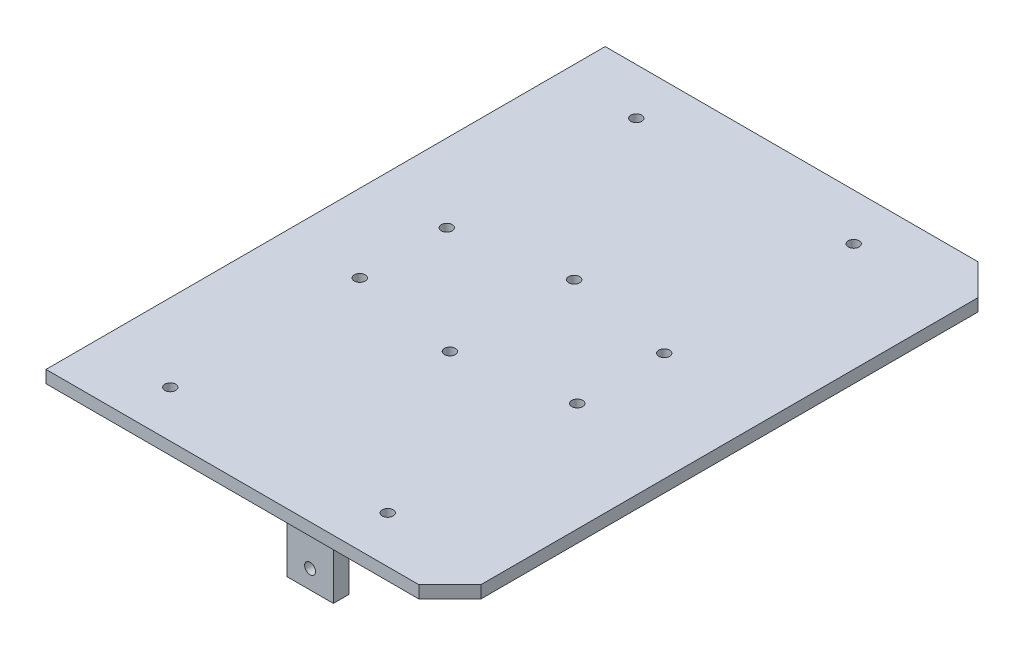
ISO-10303-21;
HEADER;
FILE_DESCRIPTION(('STEP AP214'),'2;1');
FILE_NAME('part.step','',(''),(''),'','','');
FILE_SCHEMA(('AUTOMOTIVE_DESIGN { 1 0 10303 214 1 1 1 1 }'));
ENDSEC;
DATA;
#1=APPLICATION_CONTEXT('core data for automotive mechanical design processes');
#2=APPLICATION_PROTOCOL_DEFINITION('international standard','automotive_design',2000,#1);
#3=PRODUCT_CONTEXT('',#1,'mechanical');
#4=PRODUCT('Part','Part','',(#3));
#5=PRODUCT_RELATED_PRODUCT_CATEGORY('part','',(#4));
#6=PRODUCT_DEFINITION_FORMATION('','',#4);
#7=PRODUCT_DEFINITION_CONTEXT('part definition',#1,'design');
#8=PRODUCT_DEFINITION('design','',#6,#7);
#9=PRODUCT_DEFINITION_SHAPE('','',#8);
#10=(LENGTH_UNIT() NAMED_UNIT(*) SI_UNIT(.MILLI.,.METRE.));
#11=(NAMED_UNIT(*) PLANE_ANGLE_UNIT() SI_UNIT($,.RADIAN.));
#12=(NAMED_UNIT(*) SI_UNIT($,.STERADIAN.) SOLID_ANGLE_UNIT());
#13=UNCERTAINTY_MEASURE_WITH_UNIT(LENGTH_MEASURE(1.E-05),#10,'distance_accuracy_value','');
#14=(GEOMETRIC_REPRESENTATION_CONTEXT(3) GLOBAL_UNCERTAINTY_ASSIGNED_CONTEXT((#13)) GLOBAL_UNIT_ASSIGNED_CONTEXT((#10,
#11,#12)) REPRESENTATION_CONTEXT('',''));
#15=CARTESIAN_POINT('',(0.,0.,0.));
#16=DIRECTION('',(0.,0.,1.));
#17=DIRECTION('',(1.,0.,0.));
#18=AXIS2_PLACEMENT_3D('',#15,#16,#17);
#19=CARTESIAN_POINT('',(0.,0.,0.));
#20=DIRECTION('',(0.,-1.,0.));
#21=DIRECTION('',(0.,0.,-1.));
#22=AXIS2_PLACEMENT_3D('',#19,#20,#21);
#23=PLANE('',#22);
#24=DIRECTION('',(-1.,0.,0.));
#25=VECTOR('',#24,1.);
#26=CARTESIAN_POINT('',(97.5,0.,-70.));
#27=LINE('',#26,#25);
#28=CARTESIAN_POINT('',(97.5,0.,-70.));
#29=VERTEX_POINT('',#28);
#30=CARTESIAN_POINT('',(82.5,0.,-70.));
#31=VERTEX_POINT('',#30);
#32=EDGE_CURVE('E296',#29,#31,#27,.T.);
#33=ORIENTED_EDGE('',*,*,#32,.F.);
#34=DIRECTION('',(0.,0.,1.));
#35=VECTOR('',#34,1.);
#36=CARTESIAN_POINT('',(97.5,0.,-75.));
#37=LINE('',#36,#35);
#38=CARTESIAN_POINT('',(97.5,0.,-75.));
#39=VERTEX_POINT('',#38);
#40=EDGE_CURVE('E299',#39,#29,#37,.T.);
#41=ORIENTED_EDGE('',*,*,#40,.F.);
#42=DIRECTION('',(1.,0.,0.));
#43=VECTOR('',#42,1.);
#44=CARTESIAN_POINT('',(97.5,0.,-75.));
#45=LINE('',#44,#43);
#46=CARTESIAN_POINT('',(82.5,0.,-75.));
#47=VERTEX_POINT('',#46);
#48=EDGE_CURVE('E289',#47,#39,#45,.T.);
#49=ORIENTED_EDGE('',*,*,#48,.F.);
#50=DIRECTION('',(0.,0.,-1.));
#51=VECTOR('',#50,1.);
#52=CARTESIAN_POINT('',(82.5,0.,-75.));
#53=LINE('',#52,#51);
#54=EDGE_CURVE('E292',#31,#47,#53,.T.);
#55=ORIENTED_EDGE('',*,*,#54,.F.);
#56=EDGE_LOOP('',(#33,#41,#49,#55));
#57=FACE_BOUND('',#56,.T.);
#58=DIRECTION('',(0.,0.,-1.));
#59=VECTOR('',#58,1.);
#60=CARTESIAN_POINT('',(82.5,0.,75.));
#61=LINE('',#60,#59);
#62=CARTESIAN_POINT('',(82.5,0.,75.));
#63=VERTEX_POINT('',#62);
#64=CARTESIAN_POINT('',(82.5,0.,70.));
#65=VERTEX_POINT('',#64);
#66=EDGE_CURVE('E337',#63,#65,#61,.T.);
#67=ORIENTED_EDGE('',*,*,#66,.F.);
#68=DIRECTION('',(-1.,0.,0.));
#69=VECTOR('',#68,1.);
#70=CARTESIAN_POINT('',(97.5,0.,75.));
#71=LINE('',#70,#69);
#72=CARTESIAN_POINT('',(97.5,0.,75.));
#73=VERTEX_POINT('',#72);
#74=EDGE_CURVE('E340',#73,#63,#71,.T.);
#75=ORIENTED_EDGE('',*,*,#74,.F.);
#76=DIRECTION('',(0.,0.,1.));
#77=VECTOR('',#76,1.);
#78=CARTESIAN_POINT('',(97.5,0.,75.));
#79=LINE('',#78,#77);
#80=CARTESIAN_POINT('',(97.5,0.,70.));
#81=VERTEX_POINT('',#80);
#82=EDGE_CURVE('E329',#81,#73,#79,.T.);
#83=ORIENTED_EDGE('',*,*,#82,.F.);
#84=DIRECTION('',(1.,0.,0.));
#85=VECTOR('',#84,1.);
#86=CARTESIAN_POINT('',(97.5,0.,70.));
#87=LINE('',#86,#85);
#88=EDGE_CURVE('E332',#65,#81,#87,.T.);
#89=ORIENTED_EDGE('',*,*,#88,.F.);
#90=EDGE_LOOP('',(#67,#75,#83,#89));
#91=FACE_BOUND('',#90,.T.);
#92=CARTESIAN_POINT('',(115.,0.,-75.));
#93=DIRECTION('',(0.,-1.,0.));
#94=DIRECTION('',(0.,0.,-1.));
#95=AXIS2_PLACEMENT_3D('',#92,#93,#94);
#96=CIRCLE('',#95,1.75);
#97=CARTESIAN_POINT('',(115.,0.,-76.75));
#98=VERTEX_POINT('',#97);
#99=EDGE_CURVE('E214',#98,#98,#96,.T.);
#100=ORIENTED_EDGE('',*,*,#99,.F.);
#101=EDGE_LOOP('',(#100));
#102=FACE_BOUND('',#101,.T.);
#103=CARTESIAN_POINT('',(44.9999999999999,0.,-75.));
#104=DIRECTION('',(0.,-1.,0.));
#105=DIRECTION('',(0.,0.,-1.));
#106=AXIS2_PLACEMENT_3D('',#103,#104,#105);
#107=CIRCLE('',#106,1.75);
#108=CARTESIAN_POINT('',(44.9999999999999,0.,-76.75));
#109=VERTEX_POINT('',#108);
#110=EDGE_CURVE('E218',#109,#109,#107,.T.);
#111=ORIENTED_EDGE('',*,*,#110,.F.);
#112=EDGE_LOOP('',(#111));
#113=FACE_BOUND('',#112,.T.);
#114=CARTESIAN_POINT('',(44.9999999999999,0.,-14.));
#115=DIRECTION('',(0.,-1.,0.));
#116=DIRECTION('',(0.,0.,-1.));
#117=AXIS2_PLACEMENT_3D('',#114,#115,#116);
#118=CIRCLE('',#117,1.75);
#119=CARTESIAN_POINT('',(44.9999999999999,0.,-15.75));
#120=VERTEX_POINT('',#119);
#121=EDGE_CURVE('E223',#120,#120,#118,.T.);
#122=ORIENTED_EDGE('',*,*,#121,.F.);
#123=EDGE_LOOP('',(#122));
#124=FACE_BOUND('',#123,.T.);
#125=CARTESIAN_POINT('',(44.9999999999999,0.,14.));
#126=DIRECTION('',(0.,-1.,0.));
#127=DIRECTION('',(0.,0.,-1.));
#128=AXIS2_PLACEMENT_3D('',#125,#126,#127);
#129=CIRCLE('',#128,1.75);
#130=CARTESIAN_POINT('',(44.9999999999999,0.,12.25));
#131=VERTEX_POINT('',#130);
#132=EDGE_CURVE('E227',#131,#131,#129,.T.);
#133=ORIENTED_EDGE('',*,*,#132,.F.);
#134=EDGE_LOOP('',(#133));
#135=FACE_BOUND('',#134,.T.);
#136=CARTESIAN_POINT('',(45.,0.,75.));
#137=DIRECTION('',(0.,-1.,0.));
#138=DIRECTION('',(0.,0.,-1.));
#139=AXIS2_PLACEMENT_3D('',#136,#137,#138);
#140=CIRCLE('',#139,1.75);
#141=CARTESIAN_POINT('',(45.,0.,73.25));
#142=VERTEX_POINT('',#141);
#143=EDGE_CURVE('E231',#142,#142,#140,.T.);
#144=ORIENTED_EDGE('',*,*,#143,.F.);
#145=EDGE_LOOP('',(#144));
#146=FACE_BOUND('',#145,.T.);
#147=CARTESIAN_POINT('',(115.,0.,75.));
#148=DIRECTION('',(0.,-1.,0.));
#149=DIRECTION('',(0.,0.,-1.));
#150=AXIS2_PLACEMENT_3D('',#147,#148,#149);
#151=CIRCLE('',#150,1.75);
#152=CARTESIAN_POINT('',(115.,0.,73.25));
#153=VERTEX_POINT('',#152);
#154=EDGE_CURVE('E235',#153,#153,#151,.T.);
#155=ORIENTED_EDGE('',*,*,#154,.F.);
#156=EDGE_LOOP('',(#155));
#157=FACE_BOUND('',#156,.T.);
#158=CARTESIAN_POINT('',(115.,0.,14.));
#159=DIRECTION('',(0.,-1.,0.));
#160=DIRECTION('',(0.,0.,-1.));
#161=AXIS2_PLACEMENT_3D('',#158,#159,#160);
#162=CIRCLE('',#161,1.75);
#163=CARTESIAN_POINT('',(115.,0.,12.25));
#164=VERTEX_POINT('',#163);
#165=EDGE_CURVE('E239',#164,#164,#162,.T.);
#166=ORIENTED_EDGE('',*,*,#165,.F.);
#167=EDGE_LOOP('',(#166));
#168=FACE_BOUND('',#167,.T.);
#169=CARTESIAN_POINT('',(115.,0.,-14.));
#170=DIRECTION('',(0.,-1.,0.));
#171=DIRECTION('',(0.,0.,-1.));
#172=AXIS2_PLACEMENT_3D('',#169,#170,#171);
#173=CIRCLE('',#172,1.75);
#174=CARTESIAN_POINT('',(115.,0.,-15.75));
#175=VERTEX_POINT('',#174);
#176=EDGE_CURVE('E185',#175,#175,#173,.T.);
#177=ORIENTED_EDGE('',*,*,#176,.F.);
#178=EDGE_LOOP('',(#177));
#179=FACE_BOUND('',#178,.T.);
#180=CARTESIAN_POINT('',(80.,0.,-20.));
#181=DIRECTION('',(0.,-1.,0.));
#182=DIRECTION('',(0.,0.,-1.));
#183=AXIS2_PLACEMENT_3D('',#180,#181,#182);
#184=CIRCLE('',#183,1.75);
#185=CARTESIAN_POINT('',(80.,0.,-21.75));
#186=VERTEX_POINT('',#185);
#187=EDGE_CURVE('E419',#186,#186,#184,.T.);
#188=ORIENTED_EDGE('',*,*,#187,.F.);
#189=EDGE_LOOP('',(#188));
#190=FACE_BOUND('',#189,.T.);
#191=CARTESIAN_POINT('',(80.,0.,20.));
#192=DIRECTION('',(0.,-1.,0.));
#193=DIRECTION('',(0.,0.,-1.));
#194=AXIS2_PLACEMENT_3D('',#191,#192,#193);
#195=CIRCLE('',#194,1.75);
#196=CARTESIAN_POINT('',(80.,0.,18.25));
#197=VERTEX_POINT('',#196);
#198=EDGE_CURVE('E426',#197,#197,#195,.T.);
#199=ORIENTED_EDGE('',*,*,#198,.F.);
#200=EDGE_LOOP('',(#199));
#201=FACE_BOUND('',#200,.T.);
#202=DIRECTION('',(1.,0.,0.));
#203=VECTOR('',#202,1.);
#204=CARTESIAN_POINT('',(-150.,0.,90.));
#205=LINE('',#204,#203);
#206=CARTESIAN_POINT('',(20.,0.,90.));
#207=VERTEX_POINT('',#206);
#208=CARTESIAN_POINT('',(140.,0.,90.));
#209=VERTEX_POINT('',#208);
#210=EDGE_CURVE('E177',#207,#209,#205,.T.);
#211=ORIENTED_EDGE('',*,*,#210,.F.);
#212=DIRECTION('',(0.,0.,-1.));
#213=VECTOR('',#212,1.);
#214=CARTESIAN_POINT('',(20.,0.,0.));
#215=LINE('',#214,#213);
#216=CARTESIAN_POINT('',(20.,0.,-90.));
#217=VERTEX_POINT('',#216);
#218=EDGE_CURVE('E163',#207,#217,#215,.T.);
#219=ORIENTED_EDGE('',*,*,#218,.T.);
#220=DIRECTION('',(-1.,0.,0.));
#221=VECTOR('',#220,1.);
#222=CARTESIAN_POINT('',(-150.,0.,-90.));
#223=LINE('',#222,#221);
#224=CARTESIAN_POINT('',(140.,0.,-90.));
#225=VERTEX_POINT('',#224);
#226=EDGE_CURVE('E161',#225,#217,#223,.T.);
#227=ORIENTED_EDGE('',*,*,#226,.F.);
#228=DIRECTION('',(-0.707106781186546,0.,-0.707106781186549));
#229=VECTOR('',#228,1.);
#230=CARTESIAN_POINT('',(115.,0.,-115.));
#231=LINE('',#230,#229);
#232=CARTESIAN_POINT('',(150.,0.,-80.));
#233=VERTEX_POINT('',#232);
#234=EDGE_CURVE('E196',#225,#233,#231,.F.);
#235=ORIENTED_EDGE('',*,*,#234,.T.);
#236=DIRECTION('',(0.,0.,-1.));
#237=VECTOR('',#236,1.);
#238=CARTESIAN_POINT('',(150.,0.,90.));
#239=LINE('',#238,#237);
#240=CARTESIAN_POINT('',(150.,0.,80.));
#241=VERTEX_POINT('',#240);
#242=EDGE_CURVE('E181',#241,#233,#239,.T.);
#243=ORIENTED_EDGE('',*,*,#242,.F.);
#244=DIRECTION('',(0.70710678118655,0.,-0.707106781186545));
#245=VECTOR('',#244,1.);
#246=CARTESIAN_POINT('',(114.999999999999,0.,115.));
#247=LINE('',#246,#245);
#248=EDGE_CURVE('E199',#241,#209,#247,.F.);
#249=ORIENTED_EDGE('',*,*,#248,.T.);
#250=EDGE_LOOP('',(#211,#219,#227,#235,#243,#249));
#251=FACE_BOUND('',#250,.T.);
#252=ADVANCED_FACE('F46',(#57,#91,#102,#113,#124,#135,#146,#157,#168,#179,#190,#201,#251),#23,.T.);
#253=CARTESIAN_POINT('',(-150.,4.,-90.));
#254=DIRECTION('',(0.,0.,1.));
#255=DIRECTION('',(1.,0.,0.));
#256=AXIS2_PLACEMENT_3D('',#253,#254,#255);
#257=PLANE('',#256);
#258=DIRECTION('',(0.,-1.,0.));
#259=VECTOR('',#258,1.);
#260=CARTESIAN_POINT('',(20.,4.,-90.));
#261=LINE('',#260,#259);
#262=CARTESIAN_POINT('',(20.,4.,-90.));
#263=VERTEX_POINT('',#262);
#264=EDGE_CURVE('E148',#263,#217,#261,.T.);
#265=ORIENTED_EDGE('',*,*,#264,.F.);
#266=DIRECTION('',(-1.,0.,0.));
#267=VECTOR('',#266,1.);
#268=CARTESIAN_POINT('',(-150.,4.,-90.));
#269=LINE('',#268,#267);
#270=CARTESIAN_POINT('',(140.,4.,-90.));
#271=VERTEX_POINT('',#270);
#272=EDGE_CURVE('E158',#271,#263,#269,.T.);
#273=ORIENTED_EDGE('',*,*,#272,.F.);
#274=DIRECTION('',(0.,-1.,0.));
#275=VECTOR('',#274,1.);
#276=CARTESIAN_POINT('',(140.,4.,-90.));
#277=LINE('',#276,#275);
#278=EDGE_CURVE('E56',#271,#225,#277,.T.);
#279=ORIENTED_EDGE('',*,*,#278,.T.);
#280=ORIENTED_EDGE('',*,*,#226,.T.);
#281=EDGE_LOOP('',(#265,#273,#279,#280));
#282=FACE_BOUND('',#281,.T.);
#283=ADVANCED_FACE('F156',(#282),#257,.F.);
#284=CARTESIAN_POINT('',(-150.,4.,90.));
#285=DIRECTION('',(0.,0.,-1.));
#286=DIRECTION('',(-1.,0.,0.));
#287=AXIS2_PLACEMENT_3D('',#284,#285,#286);
#288=PLANE('',#287);
#289=DIRECTION('',(0.,1.,0.));
#290=VECTOR('',#289,1.);
#291=CARTESIAN_POINT('',(20.,4.,90.));
#292=LINE('',#291,#290);
#293=CARTESIAN_POINT('',(20.,4.,90.));
#294=VERTEX_POINT('',#293);
#295=EDGE_CURVE('E62',#207,#294,#292,.T.);
#296=ORIENTED_EDGE('',*,*,#295,.F.);
#297=ORIENTED_EDGE('',*,*,#210,.T.);
#298=DIRECTION('',(0.,1.,0.));
#299=VECTOR('',#298,1.);
#300=CARTESIAN_POINT('',(140.,4.,90.));
#301=LINE('',#300,#299);
#302=CARTESIAN_POINT('',(140.,4.,90.));
#303=VERTEX_POINT('',#302);
#304=EDGE_CURVE('E203',#209,#303,#301,.T.);
#305=ORIENTED_EDGE('',*,*,#304,.T.);
#306=DIRECTION('',(1.,0.,0.));
#307=VECTOR('',#306,1.);
#308=CARTESIAN_POINT('',(-150.,4.,90.));
#309=LINE('',#308,#307);
#310=EDGE_CURVE('E170',#294,#303,#309,.T.);
#311=ORIENTED_EDGE('',*,*,#310,.F.);
#312=EDGE_LOOP('',(#296,#297,#305,#311));
#313=FACE_BOUND('',#312,.T.);
#314=ADVANCED_FACE('F391',(#313),#288,.F.);
#315=CARTESIAN_POINT('',(0.,4.,0.));
#316=DIRECTION('',(0.,-1.,0.));
#317=DIRECTION('',(0.,0.,-1.));
#318=AXIS2_PLACEMENT_3D('',#315,#316,#317);
#319=PLANE('',#318);
#320=CARTESIAN_POINT('',(115.,4.,-75.));
#321=DIRECTION('',(0.,1.,0.));
#322=DIRECTION('',(0.,0.,1.));
#323=AXIS2_PLACEMENT_3D('',#320,#321,#322);
#324=CIRCLE('',#323,1.75);
#325=CARTESIAN_POINT('',(115.,4.,-73.25));
#326=VERTEX_POINT('',#325);
#327=EDGE_CURVE('E219',#326,#326,#324,.T.);
#328=ORIENTED_EDGE('',*,*,#327,.F.);
#329=EDGE_LOOP('',(#328));
#330=FACE_BOUND('',#329,.T.);
#331=CARTESIAN_POINT('',(44.9999999999999,4.,-75.));
#332=DIRECTION('',(0.,1.,0.));
#333=DIRECTION('',(0.,0.,-1.));
#334=AXIS2_PLACEMENT_3D('',#331,#332,#333);
#335=CIRCLE('',#334,1.75);
#336=CARTESIAN_POINT('',(44.9999999999999,4.,-76.75));
#337=VERTEX_POINT('',#336);
#338=EDGE_CURVE('E344',#337,#337,#335,.T.);
#339=ORIENTED_EDGE('',*,*,#338,.F.);
#340=EDGE_LOOP('',(#339));
#341=FACE_BOUND('',#340,.T.);
#342=CARTESIAN_POINT('',(44.9999999999999,4.,-14.));
#343=DIRECTION('',(0.,1.,0.));
#344=DIRECTION('',(0.,0.,-1.));
#345=AXIS2_PLACEMENT_3D('',#342,#343,#344);
#346=CIRCLE('',#345,1.75);
#347=CARTESIAN_POINT('',(44.9999999999999,4.,-15.75));
#348=VERTEX_POINT('',#347);
#349=EDGE_CURVE('E361',#348,#348,#346,.T.);
#350=ORIENTED_EDGE('',*,*,#349,.F.);
#351=EDGE_LOOP('',(#350));
#352=FACE_BOUND('',#351,.T.);
#353=CARTESIAN_POINT('',(44.9999999999999,4.,14.));
#354=DIRECTION('',(0.,1.,0.));
#355=DIRECTION('',(0.,0.,1.));
#356=AXIS2_PLACEMENT_3D('',#353,#354,#355);
#357=CIRCLE('',#356,1.75);
#358=CARTESIAN_POINT('',(44.9999999999999,4.,15.75));
#359=VERTEX_POINT('',#358);
#360=EDGE_CURVE('E356',#359,#359,#357,.T.);
#361=ORIENTED_EDGE('',*,*,#360,.F.);
#362=EDGE_LOOP('',(#361));
#363=FACE_BOUND('',#362,.T.);
#364=CARTESIAN_POINT('',(45.,4.,75.));
#365=DIRECTION('',(0.,1.,0.));
#366=DIRECTION('',(0.,0.,1.));
#367=AXIS2_PLACEMENT_3D('',#364,#365,#366);
#368=CIRCLE('',#367,1.75);
#369=CARTESIAN_POINT('',(45.,4.,76.75));
#370=VERTEX_POINT('',#369);
#371=EDGE_CURVE('E360',#370,#370,#368,.T.);
#372=ORIENTED_EDGE('',*,*,#371,.F.);
#373=EDGE_LOOP('',(#372));
#374=FACE_BOUND('',#373,.T.);
#375=CARTESIAN_POINT('',(115.,4.,75.));
#376=DIRECTION('',(0.,1.,0.));
#377=DIRECTION('',(0.,0.,-1.));
#378=AXIS2_PLACEMENT_3D('',#375,#376,#377);
#379=CIRCLE('',#378,1.75);
#380=CARTESIAN_POINT('',(115.,4.,73.25));
#381=VERTEX_POINT('',#380);
#382=EDGE_CURVE('E376',#381,#381,#379,.T.);
#383=ORIENTED_EDGE('',*,*,#382,.F.);
#384=EDGE_LOOP('',(#383));
#385=FACE_BOUND('',#384,.T.);
#386=CARTESIAN_POINT('',(115.,4.,14.));
#387=DIRECTION('',(0.,1.,0.));
#388=DIRECTION('',(0.,0.,-1.));
#389=AXIS2_PLACEMENT_3D('',#386,#387,#388);
#390=CIRCLE('',#389,1.75);
#391=CARTESIAN_POINT('',(115.,4.,12.25));
#392=VERTEX_POINT('',#391);
#393=EDGE_CURVE('E372',#392,#392,#390,.T.);
#394=ORIENTED_EDGE('',*,*,#393,.F.);
#395=EDGE_LOOP('',(#394));
#396=FACE_BOUND('',#395,.T.);
#397=CARTESIAN_POINT('',(115.,4.,-14.));
#398=DIRECTION('',(0.,1.,0.));
#399=DIRECTION('',(0.,0.,1.));
#400=AXIS2_PLACEMENT_3D('',#397,#398,#399);
#401=CIRCLE('',#400,1.75);
#402=CARTESIAN_POINT('',(115.,4.,-12.25));
#403=VERTEX_POINT('',#402);
#404=EDGE_CURVE('E368',#403,#403,#401,.T.);
#405=ORIENTED_EDGE('',*,*,#404,.F.);
#406=EDGE_LOOP('',(#405));
#407=FACE_BOUND('',#406,.T.);
#408=CARTESIAN_POINT('',(80.,4.,-20.));
#409=DIRECTION('',(0.,1.,0.));
#410=DIRECTION('',(0.,0.,1.));
#411=AXIS2_PLACEMENT_3D('',#408,#409,#410);
#412=CIRCLE('',#411,1.75);
#413=CARTESIAN_POINT('',(80.,4.,-18.25));
#414=VERTEX_POINT('',#413);
#415=EDGE_CURVE('E410',#414,#414,#412,.T.);
#416=ORIENTED_EDGE('',*,*,#415,.F.);
#417=EDGE_LOOP('',(#416));
#418=FACE_BOUND('',#417,.T.);
#419=CARTESIAN_POINT('',(80.,4.,20.));
#420=DIRECTION('',(0.,1.,0.));
#421=DIRECTION('',(0.,0.,-1.));
#422=AXIS2_PLACEMENT_3D('',#419,#420,#421);
#423=CIRCLE('',#422,1.75);
#424=CARTESIAN_POINT('',(80.,4.,18.25));
#425=VERTEX_POINT('',#424);
#426=EDGE_CURVE('E413',#425,#425,#423,.T.);
#427=ORIENTED_EDGE('',*,*,#426,.F.);
#428=EDGE_LOOP('',(#427));
#429=FACE_BOUND('',#428,.T.);
#430=DIRECTION('',(0.,0.,-1.));
#431=VECTOR('',#430,1.);
#432=CARTESIAN_POINT('',(20.,4.,0.));
#433=LINE('',#432,#431);
#434=EDGE_CURVE('E11',#294,#263,#433,.T.);
#435=ORIENTED_EDGE('',*,*,#434,.F.);
#436=ORIENTED_EDGE('',*,*,#310,.T.);
#437=DIRECTION('',(-0.70710678118655,0.,0.707106781186545));
#438=VECTOR('',#437,1.);
#439=CARTESIAN_POINT('',(150.,4.,80.));
#440=LINE('',#439,#438);
#441=CARTESIAN_POINT('',(150.,4.,80.));
#442=VERTEX_POINT('',#441);
#443=EDGE_CURVE('E209',#303,#442,#440,.F.);
#444=ORIENTED_EDGE('',*,*,#443,.T.);
#445=DIRECTION('',(0.,0.,-1.));
#446=VECTOR('',#445,1.);
#447=CARTESIAN_POINT('',(150.,4.,90.));
#448=LINE('',#447,#446);
#449=CARTESIAN_POINT('',(150.,4.,-80.));
#450=VERTEX_POINT('',#449);
#451=EDGE_CURVE('E171',#442,#450,#448,.T.);
#452=ORIENTED_EDGE('',*,*,#451,.T.);
#453=DIRECTION('',(0.707106781186546,0.,0.707106781186549));
#454=VECTOR('',#453,1.);
#455=CARTESIAN_POINT('',(140.,4.,-90.));
#456=LINE('',#455,#454);
#457=EDGE_CURVE('E168',#450,#271,#456,.F.);
#458=ORIENTED_EDGE('',*,*,#457,.T.);
#459=ORIENTED_EDGE('',*,*,#272,.T.);
#460=EDGE_LOOP('',(#435,#436,#444,#452,#458,#459));
#461=FACE_BOUND('',#460,.T.);
#462=ADVANCED_FACE('F165',(#330,#341,#352,#363,#374,#385,#396,#407,#418,#429,#461),#319,.F.);
#463=CARTESIAN_POINT('',(150.,4.,90.));
#464=DIRECTION('',(-1.,0.,0.));
#465=DIRECTION('',(0.,0.,1.));
#466=AXIS2_PLACEMENT_3D('',#463,#464,#465);
#467=PLANE('',#466);
#468=ORIENTED_EDGE('',*,*,#451,.F.);
#469=DIRECTION('',(0.,-1.,0.));
#470=VECTOR('',#469,1.);
#471=CARTESIAN_POINT('',(150.,4.,80.));
#472=LINE('',#471,#470);
#473=EDGE_CURVE('E192',#442,#241,#472,.T.);
#474=ORIENTED_EDGE('',*,*,#473,.T.);
#475=ORIENTED_EDGE('',*,*,#242,.T.);
#476=DIRECTION('',(0.,1.,0.));
#477=VECTOR('',#476,1.);
#478=CARTESIAN_POINT('',(150.,4.,-80.));
#479=LINE('',#478,#477);
#480=EDGE_CURVE('E175',#233,#450,#479,.T.);
#481=ORIENTED_EDGE('',*,*,#480,.T.);
#482=EDGE_LOOP('',(#468,#474,#475,#481));
#483=FACE_BOUND('',#482,.T.);
#484=ADVANCED_FACE('F390',(#483),#467,.F.);
#485=CARTESIAN_POINT('',(150.,4.,80.));
#486=DIRECTION('',(-0.707106781186545,0.,-0.70710678118655));
#487=DIRECTION('',(0.,-1.,0.));
#488=AXIS2_PLACEMENT_3D('',#485,#486,#487);
#489=PLANE('',#488);
#490=ORIENTED_EDGE('',*,*,#443,.F.);
#491=ORIENTED_EDGE('',*,*,#304,.F.);
#492=ORIENTED_EDGE('',*,*,#248,.F.);
#493=ORIENTED_EDGE('',*,*,#473,.F.);
#494=EDGE_LOOP('',(#490,#491,#492,#493));
#495=FACE_BOUND('',#494,.T.);
#496=ADVANCED_FACE('F494',(#495),#489,.F.);
#497=CARTESIAN_POINT('',(140.,4.,-90.));
#498=DIRECTION('',(-0.707106781186549,0.,0.707106781186546));
#499=DIRECTION('',(0.,-1.,0.));
#500=AXIS2_PLACEMENT_3D('',#497,#498,#499);
#501=PLANE('',#500);
#502=ORIENTED_EDGE('',*,*,#457,.F.);
#503=ORIENTED_EDGE('',*,*,#480,.F.);
#504=ORIENTED_EDGE('',*,*,#234,.F.);
#505=ORIENTED_EDGE('',*,*,#278,.F.);
#506=EDGE_LOOP('',(#502,#503,#504,#505));
#507=FACE_BOUND('',#506,.T.);
#508=ADVANCED_FACE('F49',(#507),#501,.F.);
#509=CARTESIAN_POINT('',(115.,-11.,-75.));
#510=DIRECTION('',(0.,1.,0.));
#511=DIRECTION('',(0.,0.,1.));
#512=AXIS2_PLACEMENT_3D('',#509,#510,#511);
#513=CYLINDRICAL_SURFACE('',#512,1.75);
#514=ORIENTED_EDGE('',*,*,#99,.T.);
#515=EDGE_LOOP('',(#514));
#516=FACE_BOUND('',#515,.T.);
#517=ORIENTED_EDGE('',*,*,#327,.T.);
#518=EDGE_LOOP('',(#517));
#519=FACE_BOUND('',#518,.T.);
#520=ADVANCED_FACE('F386',(#516,#519),#513,.F.);
#521=CARTESIAN_POINT('',(44.9999999999999,-11.,-75.));
#522=DIRECTION('',(0.,1.,0.));
#523=DIRECTION('',(0.,0.,1.));
#524=AXIS2_PLACEMENT_3D('',#521,#522,#523);
#525=CYLINDRICAL_SURFACE('',#524,1.75);
#526=ORIENTED_EDGE('',*,*,#110,.T.);
#527=EDGE_LOOP('',(#526));
#528=FACE_BOUND('',#527,.T.);
#529=ORIENTED_EDGE('',*,*,#338,.T.);
#530=EDGE_LOOP('',(#529));
#531=FACE_BOUND('',#530,.T.);
#532=ADVANCED_FACE('F518',(#528,#531),#525,.F.);
#533=CARTESIAN_POINT('',(44.9999999999999,-11.,-14.));
#534=DIRECTION('',(0.,1.,0.));
#535=DIRECTION('',(0.,0.,1.));
#536=AXIS2_PLACEMENT_3D('',#533,#534,#535);
#537=CYLINDRICAL_SURFACE('',#536,1.75);
#538=ORIENTED_EDGE('',*,*,#121,.T.);
#539=EDGE_LOOP('',(#538));
#540=FACE_BOUND('',#539,.T.);
#541=ORIENTED_EDGE('',*,*,#349,.T.);
#542=EDGE_LOOP('',(#541));
#543=FACE_BOUND('',#542,.T.);
#544=ADVANCED_FACE('F523',(#540,#543),#537,.F.);
#545=CARTESIAN_POINT('',(44.9999999999999,-11.,14.));
#546=DIRECTION('',(0.,1.,0.));
#547=DIRECTION('',(0.,0.,1.));
#548=AXIS2_PLACEMENT_3D('',#545,#546,#547);
#549=CYLINDRICAL_SURFACE('',#548,1.75);
#550=ORIENTED_EDGE('',*,*,#132,.T.);
#551=EDGE_LOOP('',(#550));
#552=FACE_BOUND('',#551,.T.);
#553=ORIENTED_EDGE('',*,*,#360,.T.);
#554=EDGE_LOOP('',(#553));
#555=FACE_BOUND('',#554,.T.);
#556=ADVANCED_FACE('F531',(#552,#555),#549,.F.);
#557=CARTESIAN_POINT('',(45.,-11.,75.));
#558=DIRECTION('',(0.,1.,0.));
#559=DIRECTION('',(0.,0.,1.));
#560=AXIS2_PLACEMENT_3D('',#557,#558,#559);
#561=CYLINDRICAL_SURFACE('',#560,1.75);
#562=ORIENTED_EDGE('',*,*,#143,.T.);
#563=EDGE_LOOP('',(#562));
#564=FACE_BOUND('',#563,.T.);
#565=ORIENTED_EDGE('',*,*,#371,.T.);
#566=EDGE_LOOP('',(#565));
#567=FACE_BOUND('',#566,.T.);
#568=ADVANCED_FACE('F527',(#564,#567),#561,.F.);
#569=CARTESIAN_POINT('',(115.,-11.,75.));
#570=DIRECTION('',(0.,1.,0.));
#571=DIRECTION('',(0.,0.,1.));
#572=AXIS2_PLACEMENT_3D('',#569,#570,#571);
#573=CYLINDRICAL_SURFACE('',#572,1.75);
#574=ORIENTED_EDGE('',*,*,#154,.T.);
#575=EDGE_LOOP('',(#574));
#576=FACE_BOUND('',#575,.T.);
#577=ORIENTED_EDGE('',*,*,#382,.T.);
#578=EDGE_LOOP('',(#577));
#579=FACE_BOUND('',#578,.T.);
#580=ADVANCED_FACE('F530',(#576,#579),#573,.F.);
#581=CARTESIAN_POINT('',(115.,-11.,14.));
#582=DIRECTION('',(0.,1.,0.));
#583=DIRECTION('',(0.,0.,1.));
#584=AXIS2_PLACEMENT_3D('',#581,#582,#583);
#585=CYLINDRICAL_SURFACE('',#584,1.75);
#586=ORIENTED_EDGE('',*,*,#165,.T.);
#587=EDGE_LOOP('',(#586));
#588=FACE_BOUND('',#587,.T.);
#589=ORIENTED_EDGE('',*,*,#393,.T.);
#590=EDGE_LOOP('',(#589));
#591=FACE_BOUND('',#590,.T.);
#592=ADVANCED_FACE('F535',(#588,#591),#585,.F.);
#593=CARTESIAN_POINT('',(115.,-11.,-14.));
#594=DIRECTION('',(0.,1.,0.));
#595=DIRECTION('',(0.,0.,1.));
#596=AXIS2_PLACEMENT_3D('',#593,#594,#595);
#597=CYLINDRICAL_SURFACE('',#596,1.75);
#598=ORIENTED_EDGE('',*,*,#176,.T.);
#599=EDGE_LOOP('',(#598));
#600=FACE_BOUND('',#599,.T.);
#601=ORIENTED_EDGE('',*,*,#404,.T.);
#602=EDGE_LOOP('',(#601));
#603=FACE_BOUND('',#602,.T.);
#604=ADVANCED_FACE('F444',(#600,#603),#597,.F.);
#605=CARTESIAN_POINT('',(97.5,-30.,75.));
#606=DIRECTION('',(0.,0.,-1.));
#607=DIRECTION('',(-1.,0.,0.));
#608=AXIS2_PLACEMENT_3D('',#605,#606,#607);
#609=PLANE('',#608);
#610=CARTESIAN_POINT('',(90.,-24.,75.));
#611=DIRECTION('',(0.,0.,1.));
#612=DIRECTION('',(-1.,0.,0.));
#613=AXIS2_PLACEMENT_3D('',#610,#611,#612);
#614=CIRCLE('',#613,1.75);
#615=CARTESIAN_POINT('',(88.25,-24.,75.));
#616=VERTEX_POINT('',#615);
#617=EDGE_CURVE('E430',#616,#616,#614,.T.);
#618=ORIENTED_EDGE('',*,*,#617,.F.);
#619=EDGE_LOOP('',(#618));
#620=FACE_BOUND('',#619,.T.);
#621=CARTESIAN_POINT('',(90.,-6.,75.));
#622=DIRECTION('',(0.,0.,1.));
#623=DIRECTION('',(-1.,0.,0.));
#624=AXIS2_PLACEMENT_3D('',#621,#622,#623);
#625=CIRCLE('',#624,1.75);
#626=CARTESIAN_POINT('',(88.25,-6.,75.));
#627=VERTEX_POINT('',#626);
#628=EDGE_CURVE('E250',#627,#627,#625,.T.);
#629=ORIENTED_EDGE('',*,*,#628,.F.);
#630=EDGE_LOOP('',(#629));
#631=FACE_BOUND('',#630,.T.);
#632=ORIENTED_EDGE('',*,*,#74,.T.);
#633=DIRECTION('',(0.,1.,0.));
#634=VECTOR('',#633,1.);
#635=CARTESIAN_POINT('',(82.5,-30.,75.));
#636=LINE('',#635,#634);
#637=CARTESIAN_POINT('',(82.5,-30.,75.));
#638=VERTEX_POINT('',#637);
#639=EDGE_CURVE('E303',#638,#63,#636,.T.);
#640=ORIENTED_EDGE('',*,*,#639,.F.);
#641=DIRECTION('',(-1.,0.,0.));
#642=VECTOR('',#641,1.);
#643=CARTESIAN_POINT('',(97.5,-30.,75.));
#644=LINE('',#643,#642);
#645=CARTESIAN_POINT('',(97.5,-30.,75.));
#646=VERTEX_POINT('',#645);
#647=EDGE_CURVE('E333',#646,#638,#644,.T.);
#648=ORIENTED_EDGE('',*,*,#647,.F.);
#649=DIRECTION('',(0.,1.,0.));
#650=VECTOR('',#649,1.);
#651=CARTESIAN_POINT('',(97.5,-30.,75.));
#652=LINE('',#651,#650);
#653=EDGE_CURVE('E324',#646,#73,#652,.T.);
#654=ORIENTED_EDGE('',*,*,#653,.T.);
#655=EDGE_LOOP('',(#632,#640,#648,#654));
#656=FACE_BOUND('',#655,.T.);
#657=ADVANCED_FACE('F440',(#620,#631,#656),#609,.F.);
#658=CARTESIAN_POINT('',(82.5,-30.,75.));
#659=DIRECTION('',(1.,0.,0.));
#660=DIRECTION('',(0.,0.,-1.));
#661=AXIS2_PLACEMENT_3D('',#658,#659,#660);
#662=PLANE('',#661);
#663=ORIENTED_EDGE('',*,*,#66,.T.);
#664=DIRECTION('',(0.,1.,0.));
#665=VECTOR('',#664,1.);
#666=CARTESIAN_POINT('',(82.5,-30.,70.));
#667=LINE('',#666,#665);
#668=CARTESIAN_POINT('',(82.5,-30.,70.));
#669=VERTEX_POINT('',#668);
#670=EDGE_CURVE('E317',#669,#65,#667,.T.);
#671=ORIENTED_EDGE('',*,*,#670,.F.);
#672=DIRECTION('',(0.,0.,-1.));
#673=VECTOR('',#672,1.);
#674=CARTESIAN_POINT('',(82.5,-30.,75.));
#675=LINE('',#674,#673);
#676=EDGE_CURVE('E350',#638,#669,#675,.T.);
#677=ORIENTED_EDGE('',*,*,#676,.F.);
#678=ORIENTED_EDGE('',*,*,#639,.T.);
#679=EDGE_LOOP('',(#663,#671,#677,#678));
#680=FACE_BOUND('',#679,.T.);
#681=ADVANCED_FACE('F443',(#680),#662,.F.);
#682=CARTESIAN_POINT('',(97.5,-30.,70.));
#683=DIRECTION('',(0.,0.,1.));
#684=DIRECTION('',(1.,0.,0.));
#685=AXIS2_PLACEMENT_3D('',#682,#683,#684);
#686=PLANE('',#685);
#687=CARTESIAN_POINT('',(90.,-24.,70.));
#688=DIRECTION('',(0.,0.,1.));
#689=DIRECTION('',(1.,0.,0.));
#690=AXIS2_PLACEMENT_3D('',#687,#688,#689);
#691=CIRCLE('',#690,1.75);
#692=CARTESIAN_POINT('',(91.75,-24.,70.));
#693=VERTEX_POINT('',#692);
#694=EDGE_CURVE('E261',#693,#693,#691,.T.);
#695=ORIENTED_EDGE('',*,*,#694,.T.);
#696=EDGE_LOOP('',(#695));
#697=FACE_BOUND('',#696,.T.);
#698=CARTESIAN_POINT('',(90.,-6.,70.));
#699=DIRECTION('',(0.,0.,1.));
#700=DIRECTION('',(1.,0.,0.));
#701=AXIS2_PLACEMENT_3D('',#698,#699,#700);
#702=CIRCLE('',#701,1.75);
#703=CARTESIAN_POINT('',(91.75,-6.,70.));
#704=VERTEX_POINT('',#703);
#705=EDGE_CURVE('E255',#704,#704,#702,.T.);
#706=ORIENTED_EDGE('',*,*,#705,.T.);
#707=EDGE_LOOP('',(#706));
#708=FACE_BOUND('',#707,.T.);
#709=ORIENTED_EDGE('',*,*,#88,.T.);
#710=DIRECTION('',(0.,1.,0.));
#711=VECTOR('',#710,1.);
#712=CARTESIAN_POINT('',(97.5,-30.,70.));
#713=LINE('',#712,#711);
#714=CARTESIAN_POINT('',(97.5,-30.,70.));
#715=VERTEX_POINT('',#714);
#716=EDGE_CURVE('E321',#715,#81,#713,.T.);
#717=ORIENTED_EDGE('',*,*,#716,.F.);
#718=DIRECTION('',(1.,0.,0.));
#719=VECTOR('',#718,1.);
#720=CARTESIAN_POINT('',(97.5,-30.,70.));
#721=LINE('',#720,#719);
#722=EDGE_CURVE('E347',#669,#715,#721,.T.);
#723=ORIENTED_EDGE('',*,*,#722,.F.);
#724=ORIENTED_EDGE('',*,*,#670,.T.);
#725=EDGE_LOOP('',(#709,#717,#723,#724));
#726=FACE_BOUND('',#725,.T.);
#727=ADVANCED_FACE('F461',(#697,#708,#726),#686,.F.);
#728=CARTESIAN_POINT('',(97.5,-30.,75.));
#729=DIRECTION('',(-1.,0.,0.));
#730=DIRECTION('',(0.,0.,1.));
#731=AXIS2_PLACEMENT_3D('',#728,#729,#730);
#732=PLANE('',#731);
#733=ORIENTED_EDGE('',*,*,#82,.T.);
#734=ORIENTED_EDGE('',*,*,#653,.F.);
#735=DIRECTION('',(0.,0.,1.));
#736=VECTOR('',#735,1.);
#737=CARTESIAN_POINT('',(97.5,-30.,75.));
#738=LINE('',#737,#736);
#739=EDGE_CURVE('E328',#715,#646,#738,.T.);
#740=ORIENTED_EDGE('',*,*,#739,.F.);
#741=ORIENTED_EDGE('',*,*,#716,.T.);
#742=EDGE_LOOP('',(#733,#734,#740,#741));
#743=FACE_BOUND('',#742,.T.);
#744=ADVANCED_FACE('F467',(#743),#732,.F.);
#745=CARTESIAN_POINT('',(0.,-30.,0.));
#746=DIRECTION('',(0.,-1.,0.));
#747=DIRECTION('',(0.,0.,-1.));
#748=AXIS2_PLACEMENT_3D('',#745,#746,#747);
#749=PLANE('',#748);
#750=ORIENTED_EDGE('',*,*,#647,.T.);
#751=ORIENTED_EDGE('',*,*,#676,.T.);
#752=ORIENTED_EDGE('',*,*,#722,.T.);
#753=ORIENTED_EDGE('',*,*,#739,.T.);
#754=EDGE_LOOP('',(#750,#751,#752,#753));
#755=FACE_BOUND('',#754,.T.);
#756=ADVANCED_FACE('F465',(#755),#749,.T.);
#757=CARTESIAN_POINT('',(97.5,-30.,-75.));
#758=DIRECTION('',(-1.,0.,0.));
#759=DIRECTION('',(0.,0.,1.));
#760=AXIS2_PLACEMENT_3D('',#757,#758,#759);
#761=PLANE('',#760);
#762=ORIENTED_EDGE('',*,*,#40,.T.);
#763=DIRECTION('',(0.,1.,0.));
#764=VECTOR('',#763,1.);
#765=CARTESIAN_POINT('',(97.5,-30.,-70.));
#766=LINE('',#765,#764);
#767=CARTESIAN_POINT('',(97.5,-30.,-70.));
#768=VERTEX_POINT('',#767);
#769=EDGE_CURVE('E275',#768,#29,#766,.T.);
#770=ORIENTED_EDGE('',*,*,#769,.F.);
#771=DIRECTION('',(0.,0.,1.));
#772=VECTOR('',#771,1.);
#773=CARTESIAN_POINT('',(97.5,-30.,-75.));
#774=LINE('',#773,#772);
#775=CARTESIAN_POINT('',(97.5,-30.,-75.));
#776=VERTEX_POINT('',#775);
#777=EDGE_CURVE('E293',#776,#768,#774,.T.);
#778=ORIENTED_EDGE('',*,*,#777,.F.);
#779=DIRECTION('',(0.,1.,0.));
#780=VECTOR('',#779,1.);
#781=CARTESIAN_POINT('',(97.5,-30.,-75.));
#782=LINE('',#781,#780);
#783=EDGE_CURVE('E284',#776,#39,#782,.T.);
#784=ORIENTED_EDGE('',*,*,#783,.T.);
#785=EDGE_LOOP('',(#762,#770,#778,#784));
#786=FACE_BOUND('',#785,.T.);
#787=ADVANCED_FACE('F474',(#786),#761,.F.);
#788=CARTESIAN_POINT('',(97.5,-30.,-70.));
#789=DIRECTION('',(0.,0.,-1.));
#790=DIRECTION('',(-1.,0.,0.));
#791=AXIS2_PLACEMENT_3D('',#788,#789,#790);
#792=PLANE('',#791);
#793=CARTESIAN_POINT('',(90.,-24.,-70.));
#794=DIRECTION('',(0.,0.,-1.));
#795=DIRECTION('',(-1.,0.,0.));
#796=AXIS2_PLACEMENT_3D('',#793,#794,#795);
#797=CIRCLE('',#796,1.75);
#798=CARTESIAN_POINT('',(88.25,-24.,-70.));
#799=VERTEX_POINT('',#798);
#800=EDGE_CURVE('E254',#799,#799,#797,.T.);
#801=ORIENTED_EDGE('',*,*,#800,.T.);
#802=EDGE_LOOP('',(#801));
#803=FACE_BOUND('',#802,.T.);
#804=CARTESIAN_POINT('',(90.,-6.,-70.));
#805=DIRECTION('',(0.,0.,-1.));
#806=DIRECTION('',(-1.,0.,0.));
#807=AXIS2_PLACEMENT_3D('',#804,#805,#806);
#808=CIRCLE('',#807,1.75);
#809=CARTESIAN_POINT('',(88.25,-6.,-70.));
#810=VERTEX_POINT('',#809);
#811=EDGE_CURVE('E249',#810,#810,#808,.T.);
#812=ORIENTED_EDGE('',*,*,#811,.T.);
#813=EDGE_LOOP('',(#812));
#814=FACE_BOUND('',#813,.T.);
#815=ORIENTED_EDGE('',*,*,#32,.T.);
#816=DIRECTION('',(0.,1.,0.));
#817=VECTOR('',#816,1.);
#818=CARTESIAN_POINT('',(82.5,-30.,-70.));
#819=LINE('',#818,#817);
#820=CARTESIAN_POINT('',(82.5,-30.,-70.));
#821=VERTEX_POINT('',#820);
#822=EDGE_CURVE('E278',#821,#31,#819,.T.);
#823=ORIENTED_EDGE('',*,*,#822,.F.);
#824=DIRECTION('',(-1.,0.,0.));
#825=VECTOR('',#824,1.);
#826=CARTESIAN_POINT('',(97.5,-30.,-70.));
#827=LINE('',#826,#825);
#828=EDGE_CURVE('E309',#768,#821,#827,.T.);
#829=ORIENTED_EDGE('',*,*,#828,.F.);
#830=ORIENTED_EDGE('',*,*,#769,.T.);
#831=EDGE_LOOP('',(#815,#823,#829,#830));
#832=FACE_BOUND('',#831,.T.);
#833=ADVANCED_FACE('F587',(#803,#814,#832),#792,.F.);
#834=CARTESIAN_POINT('',(82.5,-30.,-75.));
#835=DIRECTION('',(1.,0.,0.));
#836=DIRECTION('',(0.,0.,-1.));
#837=AXIS2_PLACEMENT_3D('',#834,#835,#836);
#838=PLANE('',#837);
#839=ORIENTED_EDGE('',*,*,#54,.T.);
#840=DIRECTION('',(0.,1.,0.));
#841=VECTOR('',#840,1.);
#842=CARTESIAN_POINT('',(82.5,-30.,-75.));
#843=LINE('',#842,#841);
#844=CARTESIAN_POINT('',(82.5,-30.,-75.));
#845=VERTEX_POINT('',#844);
#846=EDGE_CURVE('E70',#845,#47,#843,.T.);
#847=ORIENTED_EDGE('',*,*,#846,.F.);
#848=DIRECTION('',(0.,0.,-1.));
#849=VECTOR('',#848,1.);
#850=CARTESIAN_POINT('',(82.5,-30.,-75.));
#851=LINE('',#850,#849);
#852=EDGE_CURVE('E306',#821,#845,#851,.T.);
#853=ORIENTED_EDGE('',*,*,#852,.F.);
#854=ORIENTED_EDGE('',*,*,#822,.T.);
#855=EDGE_LOOP('',(#839,#847,#853,#854));
#856=FACE_BOUND('',#855,.T.);
#857=ADVANCED_FACE('F591',(#856),#838,.F.);
#858=CARTESIAN_POINT('',(97.5,-30.,-75.));
#859=DIRECTION('',(0.,0.,1.));
#860=DIRECTION('',(1.,0.,0.));
#861=AXIS2_PLACEMENT_3D('',#858,#859,#860);
#862=PLANE('',#861);
#863=CARTESIAN_POINT('',(90.,-24.,-75.));
#864=DIRECTION('',(0.,0.,1.));
#865=DIRECTION('',(1.,0.,0.));
#866=AXIS2_PLACEMENT_3D('',#863,#864,#865);
#867=CIRCLE('',#866,1.75);
#868=CARTESIAN_POINT('',(91.75,-24.,-75.));
#869=VERTEX_POINT('',#868);
#870=EDGE_CURVE('E251',#869,#869,#867,.T.);
#871=ORIENTED_EDGE('',*,*,#870,.T.);
#872=EDGE_LOOP('',(#871));
#873=FACE_BOUND('',#872,.T.);
#874=CARTESIAN_POINT('',(90.,-6.,-75.));
#875=DIRECTION('',(0.,0.,1.));
#876=DIRECTION('',(1.,0.,0.));
#877=AXIS2_PLACEMENT_3D('',#874,#875,#876);
#878=CIRCLE('',#877,1.75);
#879=CARTESIAN_POINT('',(91.75,-6.,-75.));
#880=VERTEX_POINT('',#879);
#881=EDGE_CURVE('E246',#880,#880,#878,.T.);
#882=ORIENTED_EDGE('',*,*,#881,.T.);
#883=EDGE_LOOP('',(#882));
#884=FACE_BOUND('',#883,.T.);
#885=ORIENTED_EDGE('',*,*,#48,.T.);
#886=ORIENTED_EDGE('',*,*,#783,.F.);
#887=DIRECTION('',(1.,0.,0.));
#888=VECTOR('',#887,1.);
#889=CARTESIAN_POINT('',(97.5,-30.,-75.));
#890=LINE('',#889,#888);
#891=EDGE_CURVE('E288',#845,#776,#890,.T.);
#892=ORIENTED_EDGE('',*,*,#891,.F.);
#893=ORIENTED_EDGE('',*,*,#846,.T.);
#894=EDGE_LOOP('',(#885,#886,#892,#893));
#895=FACE_BOUND('',#894,.T.);
#896=ADVANCED_FACE('F595',(#873,#884,#895),#862,.F.);
#897=CARTESIAN_POINT('',(0.,-30.,0.));
#898=DIRECTION('',(0.,-1.,0.));
#899=DIRECTION('',(0.,0.,-1.));
#900=AXIS2_PLACEMENT_3D('',#897,#898,#899);
#901=PLANE('',#900);
#902=ORIENTED_EDGE('',*,*,#777,.T.);
#903=ORIENTED_EDGE('',*,*,#828,.T.);
#904=ORIENTED_EDGE('',*,*,#852,.T.);
#905=ORIENTED_EDGE('',*,*,#891,.T.);
#906=EDGE_LOOP('',(#902,#903,#904,#905));
#907=FACE_BOUND('',#906,.T.);
#908=ADVANCED_FACE('F599',(#907),#901,.T.);
#909=CARTESIAN_POINT('',(90.,-6.,-225.));
#910=DIRECTION('',(0.,0.,1.));
#911=DIRECTION('',(1.,0.,0.));
#912=AXIS2_PLACEMENT_3D('',#909,#910,#911);
#913=CYLINDRICAL_SURFACE('',#912,1.75);
#914=ORIENTED_EDGE('',*,*,#881,.F.);
#915=EDGE_LOOP('',(#914));
#916=FACE_BOUND('',#915,.T.);
#917=ORIENTED_EDGE('',*,*,#811,.F.);
#918=EDGE_LOOP('',(#917));
#919=FACE_BOUND('',#918,.T.);
#920=ADVANCED_FACE('F582',(#916,#919),#913,.F.);
#921=CARTESIAN_POINT('',(90.,-24.,-225.));
#922=DIRECTION('',(0.,0.,1.));
#923=DIRECTION('',(1.,0.,0.));
#924=AXIS2_PLACEMENT_3D('',#921,#922,#923);
#925=CYLINDRICAL_SURFACE('',#924,1.75);
#926=ORIENTED_EDGE('',*,*,#870,.F.);
#927=EDGE_LOOP('',(#926));
#928=FACE_BOUND('',#927,.T.);
#929=ORIENTED_EDGE('',*,*,#800,.F.);
#930=EDGE_LOOP('',(#929));
#931=FACE_BOUND('',#930,.T.);
#932=ADVANCED_FACE('F580',(#928,#931),#925,.F.);
#933=ORIENTED_EDGE('',*,*,#628,.T.);
#934=EDGE_LOOP('',(#933));
#935=FACE_BOUND('',#934,.T.);
#936=ORIENTED_EDGE('',*,*,#705,.F.);
#937=EDGE_LOOP('',(#936));
#938=FACE_BOUND('',#937,.T.);
#939=ADVANCED_FACE('F577',(#935,#938),#913,.F.);
#940=ORIENTED_EDGE('',*,*,#617,.T.);
#941=EDGE_LOOP('',(#940));
#942=FACE_BOUND('',#941,.T.);
#943=ORIENTED_EDGE('',*,*,#694,.F.);
#944=EDGE_LOOP('',(#943));
#945=FACE_BOUND('',#944,.T.);
#946=ADVANCED_FACE('F437',(#942,#945),#925,.F.);
#947=CARTESIAN_POINT('',(80.,-6.,-20.));
#948=DIRECTION('',(0.,1.,0.));
#949=DIRECTION('',(0.,0.,1.));
#950=AXIS2_PLACEMENT_3D('',#947,#948,#949);
#951=CYLINDRICAL_SURFACE('',#950,1.75);
#952=ORIENTED_EDGE('',*,*,#187,.T.);
#953=EDGE_LOOP('',(#952));
#954=FACE_BOUND('',#953,.T.);
#955=ORIENTED_EDGE('',*,*,#415,.T.);
#956=EDGE_LOOP('',(#955));
#957=FACE_BOUND('',#956,.T.);
#958=ADVANCED_FACE('F567',(#954,#957),#951,.F.);
#959=CARTESIAN_POINT('',(80.,-6.,20.));
#960=DIRECTION('',(0.,1.,0.));
#961=DIRECTION('',(0.,0.,1.));
#962=AXIS2_PLACEMENT_3D('',#959,#960,#961);
#963=CYLINDRICAL_SURFACE('',#962,1.75);
#964=ORIENTED_EDGE('',*,*,#198,.T.);
#965=EDGE_LOOP('',(#964));
#966=FACE_BOUND('',#965,.T.);
#967=ORIENTED_EDGE('',*,*,#426,.T.);
#968=EDGE_LOOP('',(#967));
#969=FACE_BOUND('',#968,.T.);
#970=ADVANCED_FACE('F566',(#966,#969),#963,.F.);
#971=CARTESIAN_POINT('',(20.,0.,0.));
#972=DIRECTION('',(-1.,0.,0.));
#973=DIRECTION('',(0.,0.,1.));
#974=AXIS2_PLACEMENT_3D('',#971,#972,#973);
#975=PLANE('',#974);
#976=ORIENTED_EDGE('',*,*,#295,.T.);
#977=ORIENTED_EDGE('',*,*,#434,.T.);
#978=ORIENTED_EDGE('',*,*,#264,.T.);
#979=ORIENTED_EDGE('',*,*,#218,.F.);
#980=EDGE_LOOP('',(#976,#977,#978,#979));
#981=FACE_BOUND('',#980,.T.);
#982=ADVANCED_FACE('F147',(#981),#975,.T.);
#983=CLOSED_SHELL('',(#252,#283,#314,#462,#484,#496,#508,#520,#532,#544,#556,#568,#580,#592,
#604,#657,#681,#727,#744,#756,#787,#833,#857,#896,#908,#920,#932,#939,#946,#958,#970,#982));
#984=MANIFOLD_SOLID_BREP('B2',#983);
#985=ADVANCED_BREP_SHAPE_REPRESENTATION('',(#18,#984),#14);
#986=SHAPE_DEFINITION_REPRESENTATION(#9,#985);
ENDSEC;
END-ISO-10303-21;
